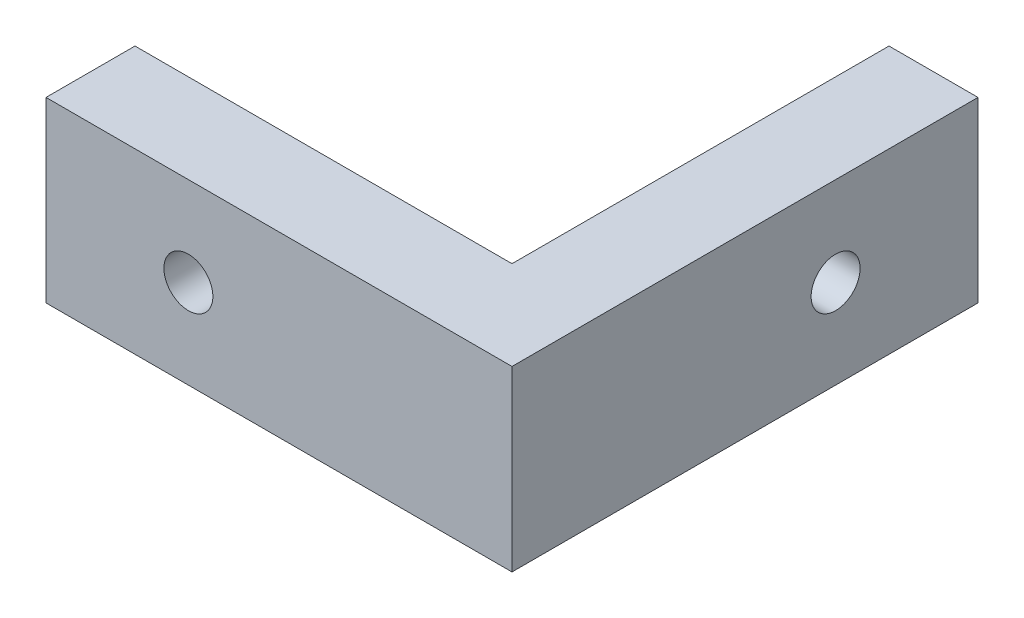
ISO-10303-21;
HEADER;
FILE_DESCRIPTION(('STEP AP214'),'2;1');
FILE_NAME('part.step','',(''),(''),'','','');
FILE_SCHEMA(('AUTOMOTIVE_DESIGN { 1 0 10303 214 1 1 1 1 }'));
ENDSEC;
DATA;
#1=APPLICATION_CONTEXT('core data for automotive mechanical design processes');
#2=APPLICATION_PROTOCOL_DEFINITION('international standard','automotive_design',2000,#1);
#3=PRODUCT_CONTEXT('',#1,'mechanical');
#4=PRODUCT('Part','Part','',(#3));
#5=PRODUCT_RELATED_PRODUCT_CATEGORY('part','',(#4));
#6=PRODUCT_DEFINITION_FORMATION('','',#4);
#7=PRODUCT_DEFINITION_CONTEXT('part definition',#1,'design');
#8=PRODUCT_DEFINITION('design','',#6,#7);
#9=PRODUCT_DEFINITION_SHAPE('','',#8);
#10=(LENGTH_UNIT() NAMED_UNIT(*) SI_UNIT(.MILLI.,.METRE.));
#11=(NAMED_UNIT(*) PLANE_ANGLE_UNIT() SI_UNIT($,.RADIAN.));
#12=(NAMED_UNIT(*) SI_UNIT($,.STERADIAN.) SOLID_ANGLE_UNIT());
#13=UNCERTAINTY_MEASURE_WITH_UNIT(LENGTH_MEASURE(1.E-05),#10,'distance_accuracy_value','');
#14=(GEOMETRIC_REPRESENTATION_CONTEXT(3) GLOBAL_UNCERTAINTY_ASSIGNED_CONTEXT((#13)) GLOBAL_UNIT_ASSIGNED_CONTEXT((#10,
#11,#12)) REPRESENTATION_CONTEXT('',''));
#15=CARTESIAN_POINT('',(0.,0.,0.));
#16=DIRECTION('',(0.,0.,1.));
#17=DIRECTION('',(1.,0.,0.));
#18=AXIS2_PLACEMENT_3D('',#15,#16,#17);
#19=CARTESIAN_POINT('',(0.,10.,0.));
#20=DIRECTION('',(-1.,0.,0.));
#21=DIRECTION('',(0.,0.,1.));
#22=AXIS2_PLACEMENT_3D('',#19,#20,#21);
#23=PLANE('',#22);
#24=CARTESIAN_POINT('',(0.,5.,-18.18));
#25=DIRECTION('',(1.,0.,0.));
#26=DIRECTION('',(0.,0.,-1.));
#27=AXIS2_PLACEMENT_3D('',#24,#25,#26);
#28=CIRCLE('',#27,1.375);
#29=CARTESIAN_POINT('',(0.,5.,-19.555));
#30=VERTEX_POINT('',#29);
#31=EDGE_CURVE('E182',#30,#30,#28,.T.);
#32=ORIENTED_EDGE('',*,*,#31,.F.);
#33=EDGE_LOOP('',(#32));
#34=FACE_BOUND('',#33,.T.);
#35=DIRECTION('',(0.,0.,-1.));
#36=VECTOR('',#35,1.);
#37=CARTESIAN_POINT('',(0.,0.,0.));
#38=LINE('',#37,#36);
#39=CARTESIAN_POINT('',(0.,0.,0.));
#40=VERTEX_POINT('',#39);
#41=CARTESIAN_POINT('',(0.,0.,-26.18));
#42=VERTEX_POINT('',#41);
#43=EDGE_CURVE('E128',#40,#42,#38,.T.);
#44=ORIENTED_EDGE('',*,*,#43,.T.);
#45=DIRECTION('',(0.,-1.,0.));
#46=VECTOR('',#45,1.);
#47=CARTESIAN_POINT('',(0.,10.,-26.18));
#48=LINE('',#47,#46);
#49=CARTESIAN_POINT('',(0.,10.,-26.18));
#50=VERTEX_POINT('',#49);
#51=EDGE_CURVE('E11',#50,#42,#48,.T.);
#52=ORIENTED_EDGE('',*,*,#51,.F.);
#53=DIRECTION('',(0.,0.,-1.));
#54=VECTOR('',#53,1.);
#55=CARTESIAN_POINT('',(0.,10.,0.));
#56=LINE('',#55,#54);
#57=CARTESIAN_POINT('',(0.,10.,0.));
#58=VERTEX_POINT('',#57);
#59=EDGE_CURVE('E145',#58,#50,#56,.T.);
#60=ORIENTED_EDGE('',*,*,#59,.F.);
#61=DIRECTION('',(0.,-1.,0.));
#62=VECTOR('',#61,1.);
#63=CARTESIAN_POINT('',(0.,10.,0.));
#64=LINE('',#63,#62);
#65=EDGE_CURVE('E124',#58,#40,#64,.T.);
#66=ORIENTED_EDGE('',*,*,#65,.T.);
#67=EDGE_LOOP('',(#44,#52,#60,#66));
#68=FACE_BOUND('',#67,.T.);
#69=ADVANCED_FACE('F39',(#34,#68),#23,.F.);
#70=CARTESIAN_POINT('',(-5.,10.,-26.18));
#71=DIRECTION('',(0.,0.,1.));
#72=DIRECTION('',(1.,0.,0.));
#73=AXIS2_PLACEMENT_3D('',#70,#71,#72);
#74=PLANE('',#73);
#75=DIRECTION('',(-1.,0.,0.));
#76=VECTOR('',#75,1.);
#77=CARTESIAN_POINT('',(-5.,0.,-26.18));
#78=LINE('',#77,#76);
#79=CARTESIAN_POINT('',(-5.,0.,-26.18));
#80=VERTEX_POINT('',#79);
#81=EDGE_CURVE('E132',#42,#80,#78,.T.);
#82=ORIENTED_EDGE('',*,*,#81,.T.);
#83=DIRECTION('',(0.,-1.,0.));
#84=VECTOR('',#83,1.);
#85=CARTESIAN_POINT('',(-5.,10.,-26.18));
#86=LINE('',#85,#84);
#87=CARTESIAN_POINT('',(-5.,10.,-26.18));
#88=VERTEX_POINT('',#87);
#89=EDGE_CURVE('E48',#88,#80,#86,.T.);
#90=ORIENTED_EDGE('',*,*,#89,.F.);
#91=DIRECTION('',(-1.,0.,0.));
#92=VECTOR('',#91,1.);
#93=CARTESIAN_POINT('',(-5.,10.,-26.18));
#94=LINE('',#93,#92);
#95=EDGE_CURVE('E93',#50,#88,#94,.T.);
#96=ORIENTED_EDGE('',*,*,#95,.F.);
#97=ORIENTED_EDGE('',*,*,#51,.T.);
#98=EDGE_LOOP('',(#82,#90,#96,#97));
#99=FACE_BOUND('',#98,.T.);
#100=ADVANCED_FACE('F175',(#99),#74,.F.);
#101=CARTESIAN_POINT('',(-5.,10.,-5.));
#102=DIRECTION('',(1.,0.,0.));
#103=DIRECTION('',(0.,0.,-1.));
#104=AXIS2_PLACEMENT_3D('',#101,#102,#103);
#105=PLANE('',#104);
#106=CARTESIAN_POINT('',(-5.,5.,-18.18));
#107=DIRECTION('',(1.,0.,0.));
#108=DIRECTION('',(0.,0.,-1.));
#109=AXIS2_PLACEMENT_3D('',#106,#107,#108);
#110=CIRCLE('',#109,1.375);
#111=CARTESIAN_POINT('',(-5.,5.,-19.555));
#112=VERTEX_POINT('',#111);
#113=EDGE_CURVE('E185',#112,#112,#110,.F.);
#114=ORIENTED_EDGE('',*,*,#113,.F.);
#115=EDGE_LOOP('',(#114));
#116=FACE_BOUND('',#115,.T.);
#117=DIRECTION('',(0.,0.,1.));
#118=VECTOR('',#117,1.);
#119=CARTESIAN_POINT('',(-5.,0.,-5.));
#120=LINE('',#119,#118);
#121=CARTESIAN_POINT('',(-5.,0.,-5.));
#122=VERTEX_POINT('',#121);
#123=EDGE_CURVE('E136',#80,#122,#120,.T.);
#124=ORIENTED_EDGE('',*,*,#123,.T.);
#125=DIRECTION('',(0.,-1.,0.));
#126=VECTOR('',#125,1.);
#127=CARTESIAN_POINT('',(-5.,10.,-5.));
#128=LINE('',#127,#126);
#129=CARTESIAN_POINT('',(-5.,10.,-5.));
#130=VERTEX_POINT('',#129);
#131=EDGE_CURVE('E117',#130,#122,#128,.T.);
#132=ORIENTED_EDGE('',*,*,#131,.F.);
#133=DIRECTION('',(0.,0.,1.));
#134=VECTOR('',#133,1.);
#135=CARTESIAN_POINT('',(-5.,10.,-5.));
#136=LINE('',#135,#134);
#137=EDGE_CURVE('E106',#88,#130,#136,.T.);
#138=ORIENTED_EDGE('',*,*,#137,.F.);
#139=ORIENTED_EDGE('',*,*,#89,.T.);
#140=EDGE_LOOP('',(#124,#132,#138,#139));
#141=FACE_BOUND('',#140,.T.);
#142=ADVANCED_FACE('F155',(#116,#141),#105,.F.);
#143=CARTESIAN_POINT('',(-5.,10.,-5.));
#144=DIRECTION('',(0.,0.,1.));
#145=DIRECTION('',(1.,0.,0.));
#146=AXIS2_PLACEMENT_3D('',#143,#144,#145);
#147=PLANE('',#146);
#148=CARTESIAN_POINT('',(-18.18,5.,-5.));
#149=DIRECTION('',(0.,0.,1.));
#150=DIRECTION('',(1.,0.,0.));
#151=AXIS2_PLACEMENT_3D('',#148,#149,#150);
#152=CIRCLE('',#151,1.375);
#153=CARTESIAN_POINT('',(-16.805,5.,-5.));
#154=VERTEX_POINT('',#153);
#155=EDGE_CURVE('E133',#154,#154,#152,.F.);
#156=ORIENTED_EDGE('',*,*,#155,.F.);
#157=EDGE_LOOP('',(#156));
#158=FACE_BOUND('',#157,.T.);
#159=DIRECTION('',(-1.,0.,0.));
#160=VECTOR('',#159,1.);
#161=CARTESIAN_POINT('',(-5.,0.,-5.));
#162=LINE('',#161,#160);
#163=CARTESIAN_POINT('',(-26.18,0.,-5.));
#164=VERTEX_POINT('',#163);
#165=EDGE_CURVE('E115',#122,#164,#162,.T.);
#166=ORIENTED_EDGE('',*,*,#165,.T.);
#167=DIRECTION('',(0.,-1.,0.));
#168=VECTOR('',#167,1.);
#169=CARTESIAN_POINT('',(-26.18,10.,-5.));
#170=LINE('',#169,#168);
#171=CARTESIAN_POINT('',(-26.18,10.,-5.));
#172=VERTEX_POINT('',#171);
#173=EDGE_CURVE('E112',#172,#164,#170,.T.);
#174=ORIENTED_EDGE('',*,*,#173,.F.);
#175=DIRECTION('',(-1.,0.,0.));
#176=VECTOR('',#175,1.);
#177=CARTESIAN_POINT('',(-5.,10.,-5.));
#178=LINE('',#177,#176);
#179=EDGE_CURVE('E100',#130,#172,#178,.T.);
#180=ORIENTED_EDGE('',*,*,#179,.F.);
#181=ORIENTED_EDGE('',*,*,#131,.T.);
#182=EDGE_LOOP('',(#166,#174,#180,#181));
#183=FACE_BOUND('',#182,.T.);
#184=ADVANCED_FACE('F113',(#158,#183),#147,.F.);
#185=CARTESIAN_POINT('',(-26.18,10.,0.));
#186=DIRECTION('',(1.,0.,0.));
#187=DIRECTION('',(0.,0.,-1.));
#188=AXIS2_PLACEMENT_3D('',#185,#186,#187);
#189=PLANE('',#188);
#190=DIRECTION('',(0.,0.,1.));
#191=VECTOR('',#190,1.);
#192=CARTESIAN_POINT('',(-26.18,0.,0.));
#193=LINE('',#192,#191);
#194=CARTESIAN_POINT('',(-26.18,0.,0.));
#195=VERTEX_POINT('',#194);
#196=EDGE_CURVE('E79',#164,#195,#193,.T.);
#197=ORIENTED_EDGE('',*,*,#196,.T.);
#198=DIRECTION('',(0.,-1.,0.));
#199=VECTOR('',#198,1.);
#200=CARTESIAN_POINT('',(-26.18,10.,0.));
#201=LINE('',#200,#199);
#202=CARTESIAN_POINT('',(-26.18,10.,0.));
#203=VERTEX_POINT('',#202);
#204=EDGE_CURVE('E118',#203,#195,#201,.T.);
#205=ORIENTED_EDGE('',*,*,#204,.F.);
#206=DIRECTION('',(0.,0.,1.));
#207=VECTOR('',#206,1.);
#208=CARTESIAN_POINT('',(-26.18,10.,0.));
#209=LINE('',#208,#207);
#210=EDGE_CURVE('E104',#172,#203,#209,.T.);
#211=ORIENTED_EDGE('',*,*,#210,.F.);
#212=ORIENTED_EDGE('',*,*,#173,.T.);
#213=EDGE_LOOP('',(#197,#205,#211,#212));
#214=FACE_BOUND('',#213,.T.);
#215=ADVANCED_FACE('F120',(#214),#189,.F.);
#216=CARTESIAN_POINT('',(0.,10.,0.));
#217=DIRECTION('',(0.,0.,-1.));
#218=DIRECTION('',(-1.,0.,0.));
#219=AXIS2_PLACEMENT_3D('',#216,#217,#218);
#220=PLANE('',#219);
#221=CARTESIAN_POINT('',(-18.18,5.,0.));
#222=DIRECTION('',(0.,0.,1.));
#223=DIRECTION('',(1.,0.,0.));
#224=AXIS2_PLACEMENT_3D('',#221,#222,#223);
#225=CIRCLE('',#224,1.375);
#226=CARTESIAN_POINT('',(-16.805,5.,0.));
#227=VERTEX_POINT('',#226);
#228=EDGE_CURVE('E189',#227,#227,#225,.T.);
#229=ORIENTED_EDGE('',*,*,#228,.F.);
#230=EDGE_LOOP('',(#229));
#231=FACE_BOUND('',#230,.T.);
#232=DIRECTION('',(1.,0.,0.));
#233=VECTOR('',#232,1.);
#234=CARTESIAN_POINT('',(0.,0.,0.));
#235=LINE('',#234,#233);
#236=EDGE_CURVE('E85',#195,#40,#235,.T.);
#237=ORIENTED_EDGE('',*,*,#236,.T.);
#238=ORIENTED_EDGE('',*,*,#65,.F.);
#239=DIRECTION('',(1.,0.,0.));
#240=VECTOR('',#239,1.);
#241=CARTESIAN_POINT('',(0.,10.,0.));
#242=LINE('',#241,#240);
#243=EDGE_CURVE('E56',#203,#58,#242,.T.);
#244=ORIENTED_EDGE('',*,*,#243,.F.);
#245=ORIENTED_EDGE('',*,*,#204,.T.);
#246=EDGE_LOOP('',(#237,#238,#244,#245));
#247=FACE_BOUND('',#246,.T.);
#248=ADVANCED_FACE('F162',(#231,#247),#220,.F.);
#249=CARTESIAN_POINT('',(0.,10.,0.));
#250=DIRECTION('',(0.,-1.,0.));
#251=DIRECTION('',(0.,0.,-1.));
#252=AXIS2_PLACEMENT_3D('',#249,#250,#251);
#253=PLANE('',#252);
#254=ORIENTED_EDGE('',*,*,#59,.T.);
#255=ORIENTED_EDGE('',*,*,#95,.T.);
#256=ORIENTED_EDGE('',*,*,#137,.T.);
#257=ORIENTED_EDGE('',*,*,#179,.T.);
#258=ORIENTED_EDGE('',*,*,#210,.T.);
#259=ORIENTED_EDGE('',*,*,#243,.T.);
#260=EDGE_LOOP('',(#254,#255,#256,#257,#258,#259));
#261=FACE_BOUND('',#260,.T.);
#262=ADVANCED_FACE('F102',(#261),#253,.F.);
#263=CARTESIAN_POINT('',(0.,0.,0.));
#264=DIRECTION('',(0.,-1.,0.));
#265=DIRECTION('',(0.,0.,-1.));
#266=AXIS2_PLACEMENT_3D('',#263,#264,#265);
#267=PLANE('',#266);
#268=ORIENTED_EDGE('',*,*,#43,.F.);
#269=ORIENTED_EDGE('',*,*,#236,.F.);
#270=ORIENTED_EDGE('',*,*,#196,.F.);
#271=ORIENTED_EDGE('',*,*,#165,.F.);
#272=ORIENTED_EDGE('',*,*,#123,.F.);
#273=ORIENTED_EDGE('',*,*,#81,.F.);
#274=EDGE_LOOP('',(#268,#269,#270,#271,#272,#273));
#275=FACE_BOUND('',#274,.T.);
#276=ADVANCED_FACE('F158',(#275),#267,.T.);
#277=CARTESIAN_POINT('',(-18.18,5.,-26.181));
#278=DIRECTION('',(0.,0.,1.));
#279=DIRECTION('',(1.,0.,0.));
#280=AXIS2_PLACEMENT_3D('',#277,#278,#279);
#281=CYLINDRICAL_SURFACE('',#280,1.375);
#282=CARTESIAN_POINT('',(-16.805,5.,0.));
#283=CARTESIAN_POINT('',(-16.805,5.,-0.0520833333333334));
#284=CARTESIAN_POINT('',(-16.805,5.,-0.104166666666667));
#285=CARTESIAN_POINT('',(-16.805,5.,-0.208333333333334));
#286=CARTESIAN_POINT('',(-16.805,5.,-0.260416666666667));
#287=CARTESIAN_POINT('',(-16.805,5.,-0.364583333333334));
#288=CARTESIAN_POINT('',(-16.805,5.,-0.416666666666667));
#289=CARTESIAN_POINT('',(-16.805,5.,-0.520833333333334));
#290=CARTESIAN_POINT('',(-16.805,5.,-0.572916666666667));
#291=CARTESIAN_POINT('',(-16.805,5.,-0.677083333333334));
#292=CARTESIAN_POINT('',(-16.805,5.,-0.729166666666667));
#293=CARTESIAN_POINT('',(-16.805,5.,-0.833333333333334));
#294=CARTESIAN_POINT('',(-16.805,5.,-0.885416666666668));
#295=CARTESIAN_POINT('',(-16.805,5.,-0.989583333333334));
#296=CARTESIAN_POINT('',(-16.805,5.,-1.04166666666667));
#297=CARTESIAN_POINT('',(-16.805,5.,-1.14583333333333));
#298=CARTESIAN_POINT('',(-16.805,5.,-1.19791666666667));
#299=CARTESIAN_POINT('',(-16.805,5.,-1.30208333333333));
#300=CARTESIAN_POINT('',(-16.805,5.,-1.35416666666667));
#301=CARTESIAN_POINT('',(-16.805,5.,-1.45833333333333));
#302=CARTESIAN_POINT('',(-16.805,5.,-1.51041666666667));
#303=CARTESIAN_POINT('',(-16.805,5.,-1.61458333333333));
#304=CARTESIAN_POINT('',(-16.805,5.,-1.66666666666667));
#305=CARTESIAN_POINT('',(-16.805,5.,-1.77083333333334));
#306=CARTESIAN_POINT('',(-16.805,5.,-1.82291666666667));
#307=CARTESIAN_POINT('',(-16.805,5.,-1.92708333333334));
#308=CARTESIAN_POINT('',(-16.805,5.,-1.97916666666667));
#309=CARTESIAN_POINT('',(-16.805,5.,-2.08333333333334));
#310=CARTESIAN_POINT('',(-16.805,5.,-2.13541666666667));
#311=CARTESIAN_POINT('',(-16.805,5.,-2.23958333333334));
#312=CARTESIAN_POINT('',(-16.805,5.,-2.29166666666667));
#313=CARTESIAN_POINT('',(-16.805,5.,-2.39583333333334));
#314=CARTESIAN_POINT('',(-16.805,5.,-2.44791666666667));
#315=CARTESIAN_POINT('',(-16.805,5.,-2.55208333333334));
#316=CARTESIAN_POINT('',(-16.805,5.,-2.60416666666667));
#317=CARTESIAN_POINT('',(-16.805,5.,-2.70833333333334));
#318=CARTESIAN_POINT('',(-16.805,5.,-2.76041666666667));
#319=CARTESIAN_POINT('',(-16.805,5.,-2.86458333333334));
#320=CARTESIAN_POINT('',(-16.805,5.,-2.91666666666667));
#321=CARTESIAN_POINT('',(-16.805,5.,-3.02083333333334));
#322=CARTESIAN_POINT('',(-16.805,5.,-3.07291666666667));
#323=CARTESIAN_POINT('',(-16.805,5.,-3.17708333333334));
#324=CARTESIAN_POINT('',(-16.805,5.,-3.22916666666667));
#325=CARTESIAN_POINT('',(-16.805,5.,-3.33333333333334));
#326=CARTESIAN_POINT('',(-16.805,5.,-3.38541666666667));
#327=CARTESIAN_POINT('',(-16.805,5.,-3.48958333333334));
#328=CARTESIAN_POINT('',(-16.805,5.,-3.54166666666667));
#329=CARTESIAN_POINT('',(-16.805,5.,-3.64583333333334));
#330=CARTESIAN_POINT('',(-16.805,5.,-3.69791666666667));
#331=CARTESIAN_POINT('',(-16.805,5.,-3.80208333333334));
#332=CARTESIAN_POINT('',(-16.805,5.,-3.85416666666667));
#333=CARTESIAN_POINT('',(-16.805,5.,-3.95833333333334));
#334=CARTESIAN_POINT('',(-16.805,5.,-4.01041666666667));
#335=CARTESIAN_POINT('',(-16.805,5.,-4.11458333333334));
#336=CARTESIAN_POINT('',(-16.805,5.,-4.16666666666667));
#337=CARTESIAN_POINT('',(-16.805,5.,-4.27083333333334));
#338=CARTESIAN_POINT('',(-16.805,5.,-4.32291666666667));
#339=CARTESIAN_POINT('',(-16.805,5.,-4.42708333333334));
#340=CARTESIAN_POINT('',(-16.805,5.,-4.47916666666667));
#341=CARTESIAN_POINT('',(-16.805,5.,-4.58333333333334));
#342=CARTESIAN_POINT('',(-16.805,5.,-4.63541666666667));
#343=CARTESIAN_POINT('',(-16.805,5.,-4.73958333333334));
#344=CARTESIAN_POINT('',(-16.805,5.,-4.79166666666667));
#345=CARTESIAN_POINT('',(-16.805,5.,-4.89583333333334));
#346=CARTESIAN_POINT('',(-16.805,5.,-4.94791666666667));
#347=CARTESIAN_POINT('',(-16.805,5.,-5.));
#348=B_SPLINE_CURVE_WITH_KNOTS('',3,(#282,#283,#284,#285,#286,#287,#288,#289,#290,#291,#292,
#293,#294,#295,#296,#297,#298,#299,#300,#301,#302,#303,#304,#305,#306,#307,#308,#309,#310,#311,
#312,#313,#314,#315,#316,#317,#318,#319,#320,#321,#322,#323,#324,#325,#326,#327,#328,#329,#330,
#331,#332,#333,#334,#335,#336,#337,#338,#339,#340,#341,#342,#343,#344,#345,#346,#347),
.UNSPECIFIED.,.F.,.F.,(4,2,2,2,2,2,2,2,2,2,2,2,2,2,2,2,2,2,2,2,2,2,2,2,2,2,2,2,2,2,2,2,4),(0.,
0.15625,0.3125,0.46875,0.625000000000001,0.781250000000001,0.937500000000001,1.09375,1.25,
1.40625,1.5625,1.71875,1.875,2.03125,2.1875,2.34375,2.5,2.65625,2.8125,2.96875,3.125,3.28125,
3.4375,3.59375,3.75,3.90625,4.0625,4.21875,4.375,4.53125,4.6875,4.84375,5.),.UNSPECIFIED.);
#349=EDGE_CURVE('BSEAM204',#227,#154,#348,.T.);
#350=ORIENTED_EDGE('',*,*,#228,.T.);
#351=ORIENTED_EDGE('',*,*,#155,.T.);
#352=ORIENTED_EDGE('',*,*,#349,.T.);
#353=ORIENTED_EDGE('',*,*,#349,.F.);
#354=EDGE_LOOP('',(#350,#352,#351,#353));
#355=FACE_BOUND('',#354,.T.);
#356=ADVANCED_FACE('F204',(#355),#281,.F.);
#357=CARTESIAN_POINT('',(-26.181,5.,-18.18));
#358=DIRECTION('',(1.,0.,0.));
#359=DIRECTION('',(0.,0.,-1.));
#360=AXIS2_PLACEMENT_3D('',#357,#358,#359);
#361=CYLINDRICAL_SURFACE('',#360,1.375);
#362=CARTESIAN_POINT('',(0.,5.,-19.555));
#363=CARTESIAN_POINT('',(-0.0520833333333334,5.,-19.555));
#364=CARTESIAN_POINT('',(-0.104166666666667,5.,-19.555));
#365=CARTESIAN_POINT('',(-0.208333333333334,5.,-19.555));
#366=CARTESIAN_POINT('',(-0.260416666666667,5.,-19.555));
#367=CARTESIAN_POINT('',(-0.364583333333334,5.,-19.555));
#368=CARTESIAN_POINT('',(-0.416666666666667,5.,-19.555));
#369=CARTESIAN_POINT('',(-0.520833333333334,5.,-19.555));
#370=CARTESIAN_POINT('',(-0.572916666666667,5.,-19.555));
#371=CARTESIAN_POINT('',(-0.677083333333334,5.,-19.555));
#372=CARTESIAN_POINT('',(-0.729166666666667,5.,-19.555));
#373=CARTESIAN_POINT('',(-0.833333333333334,5.,-19.555));
#374=CARTESIAN_POINT('',(-0.885416666666668,5.,-19.555));
#375=CARTESIAN_POINT('',(-0.989583333333334,5.,-19.555));
#376=CARTESIAN_POINT('',(-1.04166666666667,5.,-19.555));
#377=CARTESIAN_POINT('',(-1.14583333333333,5.,-19.555));
#378=CARTESIAN_POINT('',(-1.19791666666667,5.,-19.555));
#379=CARTESIAN_POINT('',(-1.30208333333333,5.,-19.555));
#380=CARTESIAN_POINT('',(-1.35416666666667,5.,-19.555));
#381=CARTESIAN_POINT('',(-1.45833333333333,5.,-19.555));
#382=CARTESIAN_POINT('',(-1.51041666666667,5.,-19.555));
#383=CARTESIAN_POINT('',(-1.61458333333333,5.,-19.555));
#384=CARTESIAN_POINT('',(-1.66666666666667,5.,-19.555));
#385=CARTESIAN_POINT('',(-1.77083333333334,5.,-19.555));
#386=CARTESIAN_POINT('',(-1.82291666666667,5.,-19.555));
#387=CARTESIAN_POINT('',(-1.92708333333334,5.,-19.555));
#388=CARTESIAN_POINT('',(-1.97916666666667,5.,-19.555));
#389=CARTESIAN_POINT('',(-2.08333333333334,5.,-19.555));
#390=CARTESIAN_POINT('',(-2.13541666666667,5.,-19.555));
#391=CARTESIAN_POINT('',(-2.23958333333334,5.,-19.555));
#392=CARTESIAN_POINT('',(-2.29166666666667,5.,-19.555));
#393=CARTESIAN_POINT('',(-2.39583333333334,5.,-19.555));
#394=CARTESIAN_POINT('',(-2.44791666666667,5.,-19.555));
#395=CARTESIAN_POINT('',(-2.55208333333334,5.,-19.555));
#396=CARTESIAN_POINT('',(-2.60416666666667,5.,-19.555));
#397=CARTESIAN_POINT('',(-2.70833333333334,5.,-19.555));
#398=CARTESIAN_POINT('',(-2.76041666666667,5.,-19.555));
#399=CARTESIAN_POINT('',(-2.86458333333334,5.,-19.555));
#400=CARTESIAN_POINT('',(-2.91666666666667,5.,-19.555));
#401=CARTESIAN_POINT('',(-3.02083333333334,5.,-19.555));
#402=CARTESIAN_POINT('',(-3.07291666666667,5.,-19.555));
#403=CARTESIAN_POINT('',(-3.17708333333334,5.,-19.555));
#404=CARTESIAN_POINT('',(-3.22916666666667,5.,-19.555));
#405=CARTESIAN_POINT('',(-3.33333333333334,5.,-19.555));
#406=CARTESIAN_POINT('',(-3.38541666666667,5.,-19.555));
#407=CARTESIAN_POINT('',(-3.48958333333334,5.,-19.555));
#408=CARTESIAN_POINT('',(-3.54166666666667,5.,-19.555));
#409=CARTESIAN_POINT('',(-3.64583333333334,5.,-19.555));
#410=CARTESIAN_POINT('',(-3.69791666666667,5.,-19.555));
#411=CARTESIAN_POINT('',(-3.80208333333334,5.,-19.555));
#412=CARTESIAN_POINT('',(-3.85416666666667,5.,-19.555));
#413=CARTESIAN_POINT('',(-3.95833333333334,5.,-19.555));
#414=CARTESIAN_POINT('',(-4.01041666666667,5.,-19.555));
#415=CARTESIAN_POINT('',(-4.11458333333334,5.,-19.555));
#416=CARTESIAN_POINT('',(-4.16666666666667,5.,-19.555));
#417=CARTESIAN_POINT('',(-4.27083333333334,5.,-19.555));
#418=CARTESIAN_POINT('',(-4.32291666666667,5.,-19.555));
#419=CARTESIAN_POINT('',(-4.42708333333334,5.,-19.555));
#420=CARTESIAN_POINT('',(-4.47916666666667,5.,-19.555));
#421=CARTESIAN_POINT('',(-4.58333333333334,5.,-19.555));
#422=CARTESIAN_POINT('',(-4.63541666666667,5.,-19.555));
#423=CARTESIAN_POINT('',(-4.73958333333334,5.,-19.555));
#424=CARTESIAN_POINT('',(-4.79166666666667,5.,-19.555));
#425=CARTESIAN_POINT('',(-4.89583333333334,5.,-19.555));
#426=CARTESIAN_POINT('',(-4.94791666666667,5.,-19.555));
#427=CARTESIAN_POINT('',(-5.,5.,-19.555));
#428=B_SPLINE_CURVE_WITH_KNOTS('',3,(#362,#363,#364,#365,#366,#367,#368,#369,#370,#371,#372,
#373,#374,#375,#376,#377,#378,#379,#380,#381,#382,#383,#384,#385,#386,#387,#388,#389,#390,#391,
#392,#393,#394,#395,#396,#397,#398,#399,#400,#401,#402,#403,#404,#405,#406,#407,#408,#409,#410,
#411,#412,#413,#414,#415,#416,#417,#418,#419,#420,#421,#422,#423,#424,#425,#426,#427),
.UNSPECIFIED.,.F.,.F.,(4,2,2,2,2,2,2,2,2,2,2,2,2,2,2,2,2,2,2,2,2,2,2,2,2,2,2,2,2,2,2,2,4),(0.,
0.15625,0.3125,0.46875,0.625000000000001,0.781250000000001,0.937500000000001,1.09375,1.25,
1.40625,1.5625,1.71875,1.875,2.03125,2.1875,2.34375,2.5,2.65625,2.8125,2.96875,3.125,3.28125,
3.4375,3.59375,3.75,3.90625,4.0625,4.21875,4.375,4.53125,4.6875,4.84375,5.),.UNSPECIFIED.);
#429=EDGE_CURVE('BSEAM217',#30,#112,#428,.T.);
#430=ORIENTED_EDGE('',*,*,#31,.T.);
#431=ORIENTED_EDGE('',*,*,#113,.T.);
#432=ORIENTED_EDGE('',*,*,#429,.T.);
#433=ORIENTED_EDGE('',*,*,#429,.F.);
#434=EDGE_LOOP('',(#430,#432,#431,#433));
#435=FACE_BOUND('',#434,.T.);
#436=ADVANCED_FACE('F217',(#435),#361,.F.);
#437=CLOSED_SHELL('',(#69,#100,#142,#184,#215,#248,#262,#276,#356,#436));
#438=MANIFOLD_SOLID_BREP('B2',#437);
#439=ADVANCED_BREP_SHAPE_REPRESENTATION('',(#18,#438),#14);
#440=SHAPE_DEFINITION_REPRESENTATION(#9,#439);
ENDSEC;
END-ISO-10303-21;
